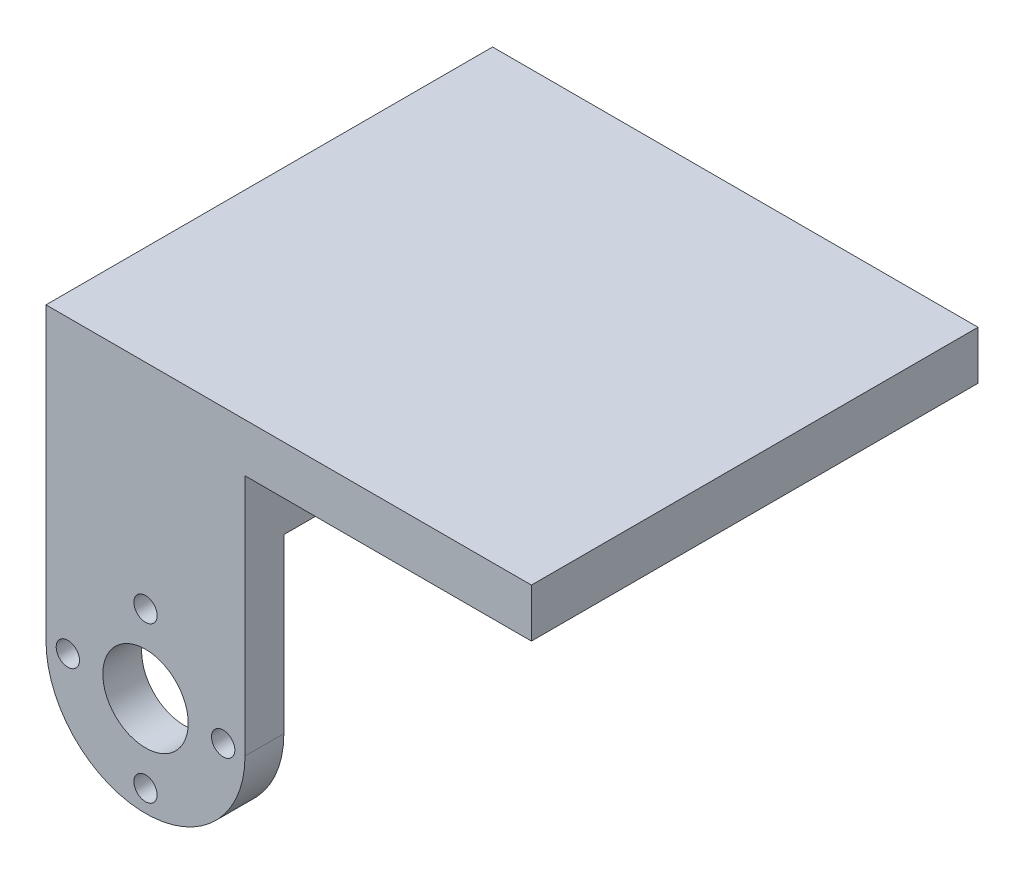
ISO-10303-21;
HEADER;
FILE_DESCRIPTION(('STEP AP214'),'2;1');
FILE_NAME('part.step','',(''),(''),'','','');
FILE_SCHEMA(('AUTOMOTIVE_DESIGN { 1 0 10303 214 1 1 1 1 }'));
ENDSEC;
DATA;
#1=APPLICATION_CONTEXT('core data for automotive mechanical design processes');
#2=APPLICATION_PROTOCOL_DEFINITION('international standard','automotive_design',2000,#1);
#3=PRODUCT_CONTEXT('',#1,'mechanical');
#4=PRODUCT('Part','Part','',(#3));
#5=PRODUCT_RELATED_PRODUCT_CATEGORY('part','',(#4));
#6=PRODUCT_DEFINITION_FORMATION('','',#4);
#7=PRODUCT_DEFINITION_CONTEXT('part definition',#1,'design');
#8=PRODUCT_DEFINITION('design','',#6,#7);
#9=PRODUCT_DEFINITION_SHAPE('','',#8);
#10=(LENGTH_UNIT() NAMED_UNIT(*) SI_UNIT(.MILLI.,.METRE.));
#11=(NAMED_UNIT(*) PLANE_ANGLE_UNIT() SI_UNIT($,.RADIAN.));
#12=(NAMED_UNIT(*) SI_UNIT($,.STERADIAN.) SOLID_ANGLE_UNIT());
#13=UNCERTAINTY_MEASURE_WITH_UNIT(LENGTH_MEASURE(1.E-05),#10,'distance_accuracy_value','');
#14=(GEOMETRIC_REPRESENTATION_CONTEXT(3) GLOBAL_UNCERTAINTY_ASSIGNED_CONTEXT((#13)) GLOBAL_UNIT_ASSIGNED_CONTEXT((#10,
#11,#12)) REPRESENTATION_CONTEXT('',''));
#15=CARTESIAN_POINT('',(0.,0.,0.));
#16=DIRECTION('',(0.,0.,1.));
#17=DIRECTION('',(1.,0.,0.));
#18=AXIS2_PLACEMENT_3D('',#15,#16,#17);
#19=CARTESIAN_POINT('',(0.,8.,-46.));
#20=DIRECTION('',(0.,0.,1.));
#21=DIRECTION('',(1.,0.,0.));
#22=AXIS2_PLACEMENT_3D('',#19,#20,#21);
#23=CYLINDRICAL_SURFACE('',#22,1.2);
#24=CARTESIAN_POINT('',(0.,8.,-4.));
#25=DIRECTION('',(0.,0.,1.));
#26=DIRECTION('',(0.,-1.,0.));
#27=AXIS2_PLACEMENT_3D('',#24,#25,#26);
#28=CIRCLE('',#27,1.2);
#29=CARTESIAN_POINT('',(0.,6.8,-4.));
#30=VERTEX_POINT('',#29);
#31=EDGE_CURVE('E184',#30,#30,#28,.F.);
#32=ORIENTED_EDGE('',*,*,#31,.T.);
#33=EDGE_LOOP('',(#32));
#34=FACE_BOUND('',#33,.T.);
#35=CARTESIAN_POINT('',(0.,8.,0.));
#36=DIRECTION('',(0.,0.,1.));
#37=DIRECTION('',(1.,0.,0.));
#38=AXIS2_PLACEMENT_3D('',#35,#36,#37);
#39=CIRCLE('',#38,1.2);
#40=CARTESIAN_POINT('',(1.2,8.,0.));
#41=VERTEX_POINT('',#40);
#42=EDGE_CURVE('E144',#41,#41,#39,.T.);
#43=ORIENTED_EDGE('',*,*,#42,.T.);
#44=EDGE_LOOP('',(#43));
#45=FACE_BOUND('',#44,.T.);
#46=ADVANCED_FACE('F71',(#34,#45),#23,.F.);
#47=CARTESIAN_POINT('',(0.,-8.,-46.));
#48=DIRECTION('',(0.,0.,1.));
#49=DIRECTION('',(1.,0.,0.));
#50=AXIS2_PLACEMENT_3D('',#47,#48,#49);
#51=CYLINDRICAL_SURFACE('',#50,1.2);
#52=CARTESIAN_POINT('',(0.,-8.,-4.));
#53=DIRECTION('',(0.,0.,1.));
#54=DIRECTION('',(0.,-1.,0.));
#55=AXIS2_PLACEMENT_3D('',#52,#53,#54);
#56=CIRCLE('',#55,1.2);
#57=CARTESIAN_POINT('',(0.,-9.2,-4.));
#58=VERTEX_POINT('',#57);
#59=EDGE_CURVE('E188',#58,#58,#56,.F.);
#60=ORIENTED_EDGE('',*,*,#59,.T.);
#61=EDGE_LOOP('',(#60));
#62=FACE_BOUND('',#61,.T.);
#63=CARTESIAN_POINT('',(0.,-8.,0.));
#64=DIRECTION('',(0.,0.,1.));
#65=DIRECTION('',(1.,0.,0.));
#66=AXIS2_PLACEMENT_3D('',#63,#64,#65);
#67=CIRCLE('',#66,1.2);
#68=CARTESIAN_POINT('',(1.19999999999994,-8.,0.));
#69=VERTEX_POINT('',#68);
#70=EDGE_CURVE('E241',#69,#69,#67,.T.);
#71=ORIENTED_EDGE('',*,*,#70,.T.);
#72=EDGE_LOOP('',(#71));
#73=FACE_BOUND('',#72,.T.);
#74=ADVANCED_FACE('F295',(#62,#73),#51,.F.);
#75=CARTESIAN_POINT('',(8.,0.,-46.));
#76=DIRECTION('',(0.,0.,1.));
#77=DIRECTION('',(1.,0.,0.));
#78=AXIS2_PLACEMENT_3D('',#75,#76,#77);
#79=CYLINDRICAL_SURFACE('',#78,1.2);
#80=CARTESIAN_POINT('',(8.,0.,-4.));
#81=DIRECTION('',(0.,0.,1.));
#82=DIRECTION('',(0.,-1.,0.));
#83=AXIS2_PLACEMENT_3D('',#80,#81,#82);
#84=CIRCLE('',#83,1.2);
#85=CARTESIAN_POINT('',(8.,-1.20000000000003,-4.));
#86=VERTEX_POINT('',#85);
#87=EDGE_CURVE('E194',#86,#86,#84,.F.);
#88=ORIENTED_EDGE('',*,*,#87,.T.);
#89=EDGE_LOOP('',(#88));
#90=FACE_BOUND('',#89,.T.);
#91=CARTESIAN_POINT('',(8.,0.,0.));
#92=DIRECTION('',(0.,0.,1.));
#93=DIRECTION('',(1.,0.,0.));
#94=AXIS2_PLACEMENT_3D('',#91,#92,#93);
#95=CIRCLE('',#94,1.2);
#96=CARTESIAN_POINT('',(9.2,0.,0.));
#97=VERTEX_POINT('',#96);
#98=EDGE_CURVE('E237',#97,#97,#95,.T.);
#99=ORIENTED_EDGE('',*,*,#98,.T.);
#100=EDGE_LOOP('',(#99));
#101=FACE_BOUND('',#100,.T.);
#102=ADVANCED_FACE('F301',(#90,#101),#79,.F.);
#103=CARTESIAN_POINT('',(0.,0.,-46.));
#104=DIRECTION('',(0.,0.,1.));
#105=DIRECTION('',(1.,0.,0.));
#106=AXIS2_PLACEMENT_3D('',#103,#104,#105);
#107=CYLINDRICAL_SURFACE('',#106,4.4);
#108=CARTESIAN_POINT('',(0.,0.,-4.));
#109=DIRECTION('',(0.,0.,1.));
#110=DIRECTION('',(0.,-1.,0.));
#111=AXIS2_PLACEMENT_3D('',#108,#109,#110);
#112=CIRCLE('',#111,4.4);
#113=CARTESIAN_POINT('',(0.,-4.4,-4.));
#114=VERTEX_POINT('',#113);
#115=EDGE_CURVE('E401',#114,#114,#112,.F.);
#116=ORIENTED_EDGE('',*,*,#115,.T.);
#117=EDGE_LOOP('',(#116));
#118=FACE_BOUND('',#117,.T.);
#119=CARTESIAN_POINT('',(0.,0.,0.));
#120=DIRECTION('',(0.,0.,1.));
#121=DIRECTION('',(1.,0.,0.));
#122=AXIS2_PLACEMENT_3D('',#119,#120,#121);
#123=CIRCLE('',#122,4.4);
#124=CARTESIAN_POINT('',(4.4,0.,0.));
#125=VERTEX_POINT('',#124);
#126=EDGE_CURVE('E233',#125,#125,#123,.T.);
#127=ORIENTED_EDGE('',*,*,#126,.T.);
#128=EDGE_LOOP('',(#127));
#129=FACE_BOUND('',#128,.T.);
#130=ADVANCED_FACE('F412',(#118,#129),#107,.F.);
#131=CARTESIAN_POINT('',(-8.,0.,-46.));
#132=DIRECTION('',(0.,0.,1.));
#133=DIRECTION('',(1.,0.,0.));
#134=AXIS2_PLACEMENT_3D('',#131,#132,#133);
#135=CYLINDRICAL_SURFACE('',#134,1.2);
#136=CARTESIAN_POINT('',(-8.,0.,-4.));
#137=DIRECTION('',(0.,0.,1.));
#138=DIRECTION('',(0.,-1.,0.));
#139=AXIS2_PLACEMENT_3D('',#136,#137,#138);
#140=CIRCLE('',#139,1.2);
#141=CARTESIAN_POINT('',(-8.,-1.19999999999992,-4.));
#142=VERTEX_POINT('',#141);
#143=EDGE_CURVE('E397',#142,#142,#140,.F.);
#144=ORIENTED_EDGE('',*,*,#143,.T.);
#145=EDGE_LOOP('',(#144));
#146=FACE_BOUND('',#145,.T.);
#147=CARTESIAN_POINT('',(-8.,0.,0.));
#148=DIRECTION('',(0.,0.,1.));
#149=DIRECTION('',(1.,0.,0.));
#150=AXIS2_PLACEMENT_3D('',#147,#148,#149);
#151=CIRCLE('',#150,1.2);
#152=CARTESIAN_POINT('',(-6.8,0.,0.));
#153=VERTEX_POINT('',#152);
#154=EDGE_CURVE('E154',#153,#153,#151,.T.);
#155=ORIENTED_EDGE('',*,*,#154,.T.);
#156=EDGE_LOOP('',(#155));
#157=FACE_BOUND('',#156,.T.);
#158=ADVANCED_FACE('F314',(#146,#157),#135,.F.);
#159=CARTESIAN_POINT('',(0.,0.,-46.));
#160=DIRECTION('',(0.,0.,1.));
#161=DIRECTION('',(1.,0.,0.));
#162=AXIS2_PLACEMENT_3D('',#159,#160,#161);
#163=CYLINDRICAL_SURFACE('',#162,10.25);
#164=CARTESIAN_POINT('',(0.,0.,-4.));
#165=DIRECTION('',(0.,0.,1.));
#166=DIRECTION('',(0.,-1.,0.));
#167=AXIS2_PLACEMENT_3D('',#164,#165,#166);
#168=CIRCLE('',#167,10.25);
#169=CARTESIAN_POINT('',(10.25,0.,-4.));
#170=VERTEX_POINT('',#169);
#171=CARTESIAN_POINT('',(-10.25,0.,-4.));
#172=VERTEX_POINT('',#171);
#173=EDGE_CURVE('E273',#170,#172,#168,.F.);
#174=ORIENTED_EDGE('',*,*,#173,.F.);
#175=DIRECTION('',(0.,0.,1.));
#176=VECTOR('',#175,1.);
#177=CARTESIAN_POINT('',(10.25,0.,-46.));
#178=LINE('',#177,#176);
#179=CARTESIAN_POINT('',(10.25,0.,0.));
#180=VERTEX_POINT('',#179);
#181=EDGE_CURVE('E258',#170,#180,#178,.T.);
#182=ORIENTED_EDGE('',*,*,#181,.T.);
#183=CARTESIAN_POINT('',(0.,0.,0.));
#184=DIRECTION('',(0.,0.,1.));
#185=DIRECTION('',(1.,0.,0.));
#186=AXIS2_PLACEMENT_3D('',#183,#184,#185);
#187=CIRCLE('',#186,10.25);
#188=CARTESIAN_POINT('',(-10.25,0.,0.));
#189=VERTEX_POINT('',#188);
#190=EDGE_CURVE('E143',#189,#180,#187,.T.);
#191=ORIENTED_EDGE('',*,*,#190,.F.);
#192=DIRECTION('',(0.,0.,1.));
#193=VECTOR('',#192,1.);
#194=CARTESIAN_POINT('',(-10.25,0.,-46.));
#195=LINE('',#194,#193);
#196=EDGE_CURVE('E137',#172,#189,#195,.T.);
#197=ORIENTED_EDGE('',*,*,#196,.F.);
#198=EDGE_LOOP('',(#174,#182,#191,#197));
#199=FACE_BOUND('',#198,.T.);
#200=ADVANCED_FACE('F271',(#199),#163,.T.);
#201=CARTESIAN_POINT('',(0.,8.,-42.));
#202=DIRECTION('',(0.,0.,-1.));
#203=DIRECTION('',(-1.,0.,0.));
#204=AXIS2_PLACEMENT_3D('',#201,#202,#203);
#205=CIRCLE('',#204,1.2);
#206=CARTESIAN_POINT('',(-1.2,8.,-42.));
#207=VERTEX_POINT('',#206);
#208=EDGE_CURVE('E320',#207,#207,#205,.F.);
#209=ORIENTED_EDGE('',*,*,#208,.T.);
#210=EDGE_LOOP('',(#209));
#211=FACE_BOUND('',#210,.T.);
#212=CARTESIAN_POINT('',(0.,8.,-46.));
#213=DIRECTION('',(0.,0.,1.));
#214=DIRECTION('',(1.,0.,0.));
#215=AXIS2_PLACEMENT_3D('',#212,#213,#214);
#216=CIRCLE('',#215,1.2);
#217=CARTESIAN_POINT('',(1.2,8.,-46.));
#218=VERTEX_POINT('',#217);
#219=EDGE_CURVE('E215',#218,#218,#216,.T.);
#220=ORIENTED_EDGE('',*,*,#219,.F.);
#221=EDGE_LOOP('',(#220));
#222=FACE_BOUND('',#221,.T.);
#223=ADVANCED_FACE('F297',(#211,#222),#23,.F.);
#224=CARTESIAN_POINT('',(0.,-8.,-42.));
#225=DIRECTION('',(0.,0.,-1.));
#226=DIRECTION('',(-1.,0.,0.));
#227=AXIS2_PLACEMENT_3D('',#224,#225,#226);
#228=CIRCLE('',#227,1.2);
#229=CARTESIAN_POINT('',(-1.20000000000006,-8.,-42.));
#230=VERTEX_POINT('',#229);
#231=EDGE_CURVE('E386',#230,#230,#228,.F.);
#232=ORIENTED_EDGE('',*,*,#231,.T.);
#233=EDGE_LOOP('',(#232));
#234=FACE_BOUND('',#233,.T.);
#235=CARTESIAN_POINT('',(0.,-8.,-46.));
#236=DIRECTION('',(0.,0.,1.));
#237=DIRECTION('',(1.,0.,0.));
#238=AXIS2_PLACEMENT_3D('',#235,#236,#237);
#239=CIRCLE('',#238,1.2);
#240=CARTESIAN_POINT('',(1.19999999999994,-8.,-46.));
#241=VERTEX_POINT('',#240);
#242=EDGE_CURVE('E211',#241,#241,#239,.T.);
#243=ORIENTED_EDGE('',*,*,#242,.F.);
#244=EDGE_LOOP('',(#243));
#245=FACE_BOUND('',#244,.T.);
#246=ADVANCED_FACE('F304',(#234,#245),#51,.F.);
#247=CARTESIAN_POINT('',(8.,0.,-42.));
#248=DIRECTION('',(0.,0.,-1.));
#249=DIRECTION('',(-1.,0.,0.));
#250=AXIS2_PLACEMENT_3D('',#247,#248,#249);
#251=CIRCLE('',#250,1.2);
#252=CARTESIAN_POINT('',(6.8,0.,-42.));
#253=VERTEX_POINT('',#252);
#254=EDGE_CURVE('E382',#253,#253,#251,.F.);
#255=ORIENTED_EDGE('',*,*,#254,.T.);
#256=EDGE_LOOP('',(#255));
#257=FACE_BOUND('',#256,.T.);
#258=CARTESIAN_POINT('',(8.,0.,-46.));
#259=DIRECTION('',(0.,0.,1.));
#260=DIRECTION('',(1.,0.,0.));
#261=AXIS2_PLACEMENT_3D('',#258,#259,#260);
#262=CIRCLE('',#261,1.2);
#263=CARTESIAN_POINT('',(9.2,0.,-46.));
#264=VERTEX_POINT('',#263);
#265=EDGE_CURVE('E207',#264,#264,#262,.T.);
#266=ORIENTED_EDGE('',*,*,#265,.F.);
#267=EDGE_LOOP('',(#266));
#268=FACE_BOUND('',#267,.T.);
#269=ADVANCED_FACE('F312',(#257,#268),#79,.F.);
#270=CARTESIAN_POINT('',(0.,0.,-42.));
#271=DIRECTION('',(0.,0.,-1.));
#272=DIRECTION('',(-1.,0.,0.));
#273=AXIS2_PLACEMENT_3D('',#270,#271,#272);
#274=CIRCLE('',#273,4.4);
#275=CARTESIAN_POINT('',(-4.4,0.,-42.));
#276=VERTEX_POINT('',#275);
#277=EDGE_CURVE('E378',#276,#276,#274,.F.);
#278=ORIENTED_EDGE('',*,*,#277,.T.);
#279=EDGE_LOOP('',(#278));
#280=FACE_BOUND('',#279,.T.);
#281=CARTESIAN_POINT('',(0.,0.,-46.));
#282=DIRECTION('',(0.,0.,1.));
#283=DIRECTION('',(1.,0.,0.));
#284=AXIS2_PLACEMENT_3D('',#281,#282,#283);
#285=CIRCLE('',#284,4.4);
#286=CARTESIAN_POINT('',(4.4,0.,-46.));
#287=VERTEX_POINT('',#286);
#288=EDGE_CURVE('E202',#287,#287,#285,.T.);
#289=ORIENTED_EDGE('',*,*,#288,.F.);
#290=EDGE_LOOP('',(#289));
#291=FACE_BOUND('',#290,.T.);
#292=ADVANCED_FACE('F442',(#280,#291),#107,.F.);
#293=CARTESIAN_POINT('',(-8.,0.,-42.));
#294=DIRECTION('',(0.,0.,-1.));
#295=DIRECTION('',(-1.,0.,0.));
#296=AXIS2_PLACEMENT_3D('',#293,#294,#295);
#297=CIRCLE('',#296,1.2);
#298=CARTESIAN_POINT('',(-9.2,0.,-42.));
#299=VERTEX_POINT('',#298);
#300=EDGE_CURVE('E374',#299,#299,#297,.F.);
#301=ORIENTED_EDGE('',*,*,#300,.T.);
#302=EDGE_LOOP('',(#301));
#303=FACE_BOUND('',#302,.T.);
#304=CARTESIAN_POINT('',(-8.,0.,-46.));
#305=DIRECTION('',(0.,0.,1.));
#306=DIRECTION('',(1.,0.,0.));
#307=AXIS2_PLACEMENT_3D('',#304,#305,#306);
#308=CIRCLE('',#307,1.2);
#309=CARTESIAN_POINT('',(-6.8,0.,-46.));
#310=VERTEX_POINT('',#309);
#311=EDGE_CURVE('E198',#310,#310,#308,.T.);
#312=ORIENTED_EDGE('',*,*,#311,.F.);
#313=EDGE_LOOP('',(#312));
#314=FACE_BOUND('',#313,.T.);
#315=ADVANCED_FACE('F325',(#303,#314),#135,.F.);
#316=CARTESIAN_POINT('',(0.,0.,-46.));
#317=DIRECTION('',(0.,0.,1.));
#318=DIRECTION('',(1.,0.,0.));
#319=AXIS2_PLACEMENT_3D('',#316,#317,#318);
#320=PLANE('',#319);
#321=ORIENTED_EDGE('',*,*,#311,.T.);
#322=EDGE_LOOP('',(#321));
#323=FACE_BOUND('',#322,.T.);
#324=ORIENTED_EDGE('',*,*,#288,.T.);
#325=EDGE_LOOP('',(#324));
#326=FACE_BOUND('',#325,.T.);
#327=ORIENTED_EDGE('',*,*,#265,.T.);
#328=EDGE_LOOP('',(#327));
#329=FACE_BOUND('',#328,.T.);
#330=ORIENTED_EDGE('',*,*,#242,.T.);
#331=EDGE_LOOP('',(#330));
#332=FACE_BOUND('',#331,.T.);
#333=ORIENTED_EDGE('',*,*,#219,.T.);
#334=EDGE_LOOP('',(#333));
#335=FACE_BOUND('',#334,.T.);
#336=DIRECTION('',(0.,1.,0.));
#337=VECTOR('',#336,1.);
#338=CARTESIAN_POINT('',(-10.25,0.,-46.));
#339=LINE('',#338,#337);
#340=CARTESIAN_POINT('',(-10.25,0.,-46.));
#341=VERTEX_POINT('',#340);
#342=CARTESIAN_POINT('',(-10.25,30.,-46.));
#343=VERTEX_POINT('',#342);
#344=EDGE_CURVE('E219',#341,#343,#339,.T.);
#345=ORIENTED_EDGE('',*,*,#344,.T.);
#346=DIRECTION('',(1.,0.,0.));
#347=VECTOR('',#346,1.);
#348=CARTESIAN_POINT('',(-10.25,30.,-46.));
#349=LINE('',#348,#347);
#350=CARTESIAN_POINT('',(39.75,30.,-46.));
#351=VERTEX_POINT('',#350);
#352=EDGE_CURVE('E152',#343,#351,#349,.T.);
#353=ORIENTED_EDGE('',*,*,#352,.T.);
#354=DIRECTION('',(0.,1.,0.));
#355=VECTOR('',#354,1.);
#356=CARTESIAN_POINT('',(39.75,25.,-46.));
#357=LINE('',#356,#355);
#358=CARTESIAN_POINT('',(39.75,25.,-46.));
#359=VERTEX_POINT('',#358);
#360=EDGE_CURVE('E165',#359,#351,#357,.T.);
#361=ORIENTED_EDGE('',*,*,#360,.F.);
#362=DIRECTION('',(1.,0.,0.));
#363=VECTOR('',#362,1.);
#364=CARTESIAN_POINT('',(-10.25,25.,-46.));
#365=LINE('',#364,#363);
#366=CARTESIAN_POINT('',(10.25,25.,-46.));
#367=VERTEX_POINT('',#366);
#368=EDGE_CURVE('E161',#367,#359,#365,.T.);
#369=ORIENTED_EDGE('',*,*,#368,.F.);
#370=DIRECTION('',(0.,1.,0.));
#371=VECTOR('',#370,1.);
#372=CARTESIAN_POINT('',(10.25,0.,-46.));
#373=LINE('',#372,#371);
#374=CARTESIAN_POINT('',(10.25,0.,-46.));
#375=VERTEX_POINT('',#374);
#376=EDGE_CURVE('E226',#375,#367,#373,.T.);
#377=ORIENTED_EDGE('',*,*,#376,.F.);
#378=CARTESIAN_POINT('',(0.,0.,-46.));
#379=DIRECTION('',(0.,0.,1.));
#380=DIRECTION('',(1.,0.,0.));
#381=AXIS2_PLACEMENT_3D('',#378,#379,#380);
#382=CIRCLE('',#381,10.25);
#383=EDGE_CURVE('E222',#341,#375,#382,.T.);
#384=ORIENTED_EDGE('',*,*,#383,.F.);
#385=EDGE_LOOP('',(#345,#353,#361,#369,#377,#384));
#386=FACE_BOUND('',#385,.T.);
#387=ADVANCED_FACE('F323',(#323,#326,#329,#332,#335,#386),#320,.F.);
#388=CARTESIAN_POINT('',(0.,0.,-42.));
#389=DIRECTION('',(0.,0.,-1.));
#390=DIRECTION('',(-1.,0.,0.));
#391=AXIS2_PLACEMENT_3D('',#388,#389,#390);
#392=CIRCLE('',#391,10.25);
#393=CARTESIAN_POINT('',(-10.25,0.,-42.));
#394=VERTEX_POINT('',#393);
#395=CARTESIAN_POINT('',(10.25,0.,-42.));
#396=VERTEX_POINT('',#395);
#397=EDGE_CURVE('E371',#394,#396,#392,.F.);
#398=ORIENTED_EDGE('',*,*,#397,.F.);
#399=EDGE_CURVE('E259',#341,#394,#195,.T.);
#400=ORIENTED_EDGE('',*,*,#399,.F.);
#401=ORIENTED_EDGE('',*,*,#383,.T.);
#402=EDGE_CURVE('E254',#375,#396,#178,.T.);
#403=ORIENTED_EDGE('',*,*,#402,.T.);
#404=EDGE_LOOP('',(#398,#400,#401,#403));
#405=FACE_BOUND('',#404,.T.);
#406=ADVANCED_FACE('F316',(#405),#163,.T.);
#407=CARTESIAN_POINT('',(0.,0.,0.));
#408=DIRECTION('',(0.,0.,1.));
#409=DIRECTION('',(1.,0.,0.));
#410=AXIS2_PLACEMENT_3D('',#407,#408,#409);
#411=PLANE('',#410);
#412=ORIENTED_EDGE('',*,*,#154,.F.);
#413=EDGE_LOOP('',(#412));
#414=FACE_BOUND('',#413,.T.);
#415=ORIENTED_EDGE('',*,*,#126,.F.);
#416=EDGE_LOOP('',(#415));
#417=FACE_BOUND('',#416,.T.);
#418=ORIENTED_EDGE('',*,*,#98,.F.);
#419=EDGE_LOOP('',(#418));
#420=FACE_BOUND('',#419,.T.);
#421=ORIENTED_EDGE('',*,*,#70,.F.);
#422=EDGE_LOOP('',(#421));
#423=FACE_BOUND('',#422,.T.);
#424=ORIENTED_EDGE('',*,*,#42,.F.);
#425=EDGE_LOOP('',(#424));
#426=FACE_BOUND('',#425,.T.);
#427=DIRECTION('',(0.,1.,0.));
#428=VECTOR('',#427,1.);
#429=CARTESIAN_POINT('',(-10.25,0.,0.));
#430=LINE('',#429,#428);
#431=CARTESIAN_POINT('',(-10.25,30.,0.));
#432=VERTEX_POINT('',#431);
#433=EDGE_CURVE('E129',#189,#432,#430,.T.);
#434=ORIENTED_EDGE('',*,*,#433,.F.);
#435=ORIENTED_EDGE('',*,*,#190,.T.);
#436=DIRECTION('',(0.,1.,0.));
#437=VECTOR('',#436,1.);
#438=CARTESIAN_POINT('',(10.25,0.,0.));
#439=LINE('',#438,#437);
#440=CARTESIAN_POINT('',(10.25,25.,0.));
#441=VERTEX_POINT('',#440);
#442=EDGE_CURVE('E203',#180,#441,#439,.T.);
#443=ORIENTED_EDGE('',*,*,#442,.T.);
#444=DIRECTION('',(1.,0.,0.));
#445=VECTOR('',#444,1.);
#446=CARTESIAN_POINT('',(-10.25,25.,0.));
#447=LINE('',#446,#445);
#448=CARTESIAN_POINT('',(39.75,25.,0.));
#449=VERTEX_POINT('',#448);
#450=EDGE_CURVE('E167',#441,#449,#447,.T.);
#451=ORIENTED_EDGE('',*,*,#450,.T.);
#452=DIRECTION('',(0.,1.,0.));
#453=VECTOR('',#452,1.);
#454=CARTESIAN_POINT('',(39.75,25.,0.));
#455=LINE('',#454,#453);
#456=CARTESIAN_POINT('',(39.75,30.,0.));
#457=VERTEX_POINT('',#456);
#458=EDGE_CURVE('E159',#449,#457,#455,.T.);
#459=ORIENTED_EDGE('',*,*,#458,.T.);
#460=DIRECTION('',(1.,0.,0.));
#461=VECTOR('',#460,1.);
#462=CARTESIAN_POINT('',(-10.25,30.,0.));
#463=LINE('',#462,#461);
#464=EDGE_CURVE('E150',#432,#457,#463,.T.);
#465=ORIENTED_EDGE('',*,*,#464,.F.);
#466=EDGE_LOOP('',(#434,#435,#443,#451,#459,#465));
#467=FACE_BOUND('',#466,.T.);
#468=ADVANCED_FACE('F157',(#414,#417,#420,#423,#426,#467),#411,.T.);
#469=CARTESIAN_POINT('',(10.25,0.,-46.));
#470=DIRECTION('',(1.,0.,0.));
#471=DIRECTION('',(0.,0.,-1.));
#472=AXIS2_PLACEMENT_3D('',#469,#470,#471);
#473=PLANE('',#472);
#474=DIRECTION('',(0.,-1.,0.));
#475=VECTOR('',#474,1.);
#476=CARTESIAN_POINT('',(10.25,0.,-4.));
#477=LINE('',#476,#475);
#478=CARTESIAN_POINT('',(10.25,17.75,-4.));
#479=VERTEX_POINT('',#478);
#480=EDGE_CURVE('E392',#479,#170,#477,.T.);
#481=ORIENTED_EDGE('',*,*,#480,.F.);
#482=DIRECTION('',(0.,0.,1.));
#483=VECTOR('',#482,1.);
#484=CARTESIAN_POINT('',(10.25,17.75,-46.));
#485=LINE('',#484,#483);
#486=CARTESIAN_POINT('',(10.25,17.75,-42.));
#487=VERTEX_POINT('',#486);
#488=EDGE_CURVE('E356',#487,#479,#485,.T.);
#489=ORIENTED_EDGE('',*,*,#488,.F.);
#490=DIRECTION('',(0.,1.,0.));
#491=VECTOR('',#490,1.);
#492=CARTESIAN_POINT('',(10.25,0.,-42.));
#493=LINE('',#492,#491);
#494=EDGE_CURVE('E353',#396,#487,#493,.T.);
#495=ORIENTED_EDGE('',*,*,#494,.F.);
#496=ORIENTED_EDGE('',*,*,#402,.F.);
#497=ORIENTED_EDGE('',*,*,#376,.T.);
#498=DIRECTION('',(0.,0.,1.));
#499=VECTOR('',#498,1.);
#500=CARTESIAN_POINT('',(10.25,25.,-46.));
#501=LINE('',#500,#499);
#502=EDGE_CURVE('E80',#367,#441,#501,.T.);
#503=ORIENTED_EDGE('',*,*,#502,.T.);
#504=ORIENTED_EDGE('',*,*,#442,.F.);
#505=ORIENTED_EDGE('',*,*,#181,.F.);
#506=EDGE_LOOP('',(#481,#489,#495,#496,#497,#503,#504,#505));
#507=FACE_BOUND('',#506,.T.);
#508=ADVANCED_FACE('F277',(#507),#473,.T.);
#509=CARTESIAN_POINT('',(-10.25,0.,-46.));
#510=DIRECTION('',(1.,0.,0.));
#511=DIRECTION('',(0.,0.,-1.));
#512=AXIS2_PLACEMENT_3D('',#509,#510,#511);
#513=PLANE('',#512);
#514=DIRECTION('',(0.,0.,-1.));
#515=VECTOR('',#514,1.);
#516=CARTESIAN_POINT('',(-10.25,17.75,-4.));
#517=LINE('',#516,#515);
#518=CARTESIAN_POINT('',(-10.25,17.75,-4.));
#519=VERTEX_POINT('',#518);
#520=CARTESIAN_POINT('',(-10.25,17.75,-42.));
#521=VERTEX_POINT('',#520);
#522=EDGE_CURVE('E358',#519,#521,#517,.T.);
#523=ORIENTED_EDGE('',*,*,#522,.F.);
#524=DIRECTION('',(0.,-1.,0.));
#525=VECTOR('',#524,1.);
#526=CARTESIAN_POINT('',(-10.25,0.,-4.));
#527=LINE('',#526,#525);
#528=EDGE_CURVE('E12',#519,#172,#527,.T.);
#529=ORIENTED_EDGE('',*,*,#528,.T.);
#530=ORIENTED_EDGE('',*,*,#196,.T.);
#531=ORIENTED_EDGE('',*,*,#433,.T.);
#532=DIRECTION('',(0.,0.,1.));
#533=VECTOR('',#532,1.);
#534=CARTESIAN_POINT('',(-10.25,30.,-46.));
#535=LINE('',#534,#533);
#536=EDGE_CURVE('E134',#343,#432,#535,.T.);
#537=ORIENTED_EDGE('',*,*,#536,.F.);
#538=ORIENTED_EDGE('',*,*,#344,.F.);
#539=ORIENTED_EDGE('',*,*,#399,.T.);
#540=DIRECTION('',(0.,-1.,0.));
#541=VECTOR('',#540,1.);
#542=CARTESIAN_POINT('',(-10.25,-10.25,-42.));
#543=LINE('',#542,#541);
#544=EDGE_CURVE('E351',#521,#394,#543,.T.);
#545=ORIENTED_EDGE('',*,*,#544,.F.);
#546=EDGE_LOOP('',(#523,#529,#530,#531,#537,#538,#539,#545));
#547=FACE_BOUND('',#546,.T.);
#548=ADVANCED_FACE('F132',(#547),#513,.F.);
#549=CARTESIAN_POINT('',(-10.25,30.,-46.));
#550=DIRECTION('',(0.,-1.,0.));
#551=DIRECTION('',(0.,0.,-1.));
#552=AXIS2_PLACEMENT_3D('',#549,#550,#551);
#553=PLANE('',#552);
#554=ORIENTED_EDGE('',*,*,#464,.T.);
#555=DIRECTION('',(0.,0.,1.));
#556=VECTOR('',#555,1.);
#557=CARTESIAN_POINT('',(39.75,30.,-46.));
#558=LINE('',#557,#556);
#559=EDGE_CURVE('E155',#351,#457,#558,.T.);
#560=ORIENTED_EDGE('',*,*,#559,.F.);
#561=ORIENTED_EDGE('',*,*,#352,.F.);
#562=ORIENTED_EDGE('',*,*,#536,.T.);
#563=EDGE_LOOP('',(#554,#560,#561,#562));
#564=FACE_BOUND('',#563,.T.);
#565=ADVANCED_FACE('F148',(#564),#553,.F.);
#566=CARTESIAN_POINT('',(39.75,25.,-46.));
#567=DIRECTION('',(1.,0.,0.));
#568=DIRECTION('',(0.,0.,-1.));
#569=AXIS2_PLACEMENT_3D('',#566,#567,#568);
#570=PLANE('',#569);
#571=ORIENTED_EDGE('',*,*,#458,.F.);
#572=DIRECTION('',(0.,0.,1.));
#573=VECTOR('',#572,1.);
#574=CARTESIAN_POINT('',(39.75,25.,-46.));
#575=LINE('',#574,#573);
#576=EDGE_CURVE('E172',#359,#449,#575,.T.);
#577=ORIENTED_EDGE('',*,*,#576,.F.);
#578=ORIENTED_EDGE('',*,*,#360,.T.);
#579=ORIENTED_EDGE('',*,*,#559,.T.);
#580=EDGE_LOOP('',(#571,#577,#578,#579));
#581=FACE_BOUND('',#580,.T.);
#582=ADVANCED_FACE('F281',(#581),#570,.T.);
#583=CARTESIAN_POINT('',(-10.25,25.,-46.));
#584=DIRECTION('',(0.,-1.,0.));
#585=DIRECTION('',(0.,0.,-1.));
#586=AXIS2_PLACEMENT_3D('',#583,#584,#585);
#587=PLANE('',#586);
#588=ORIENTED_EDGE('',*,*,#502,.F.);
#589=ORIENTED_EDGE('',*,*,#368,.T.);
#590=ORIENTED_EDGE('',*,*,#576,.T.);
#591=ORIENTED_EDGE('',*,*,#450,.F.);
#592=EDGE_LOOP('',(#588,#589,#590,#591));
#593=FACE_BOUND('',#592,.T.);
#594=ADVANCED_FACE('F73',(#593),#587,.T.);
#595=CARTESIAN_POINT('',(35.75,-10.25,-4.));
#596=DIRECTION('',(0.,0.,1.));
#597=DIRECTION('',(0.,-1.,0.));
#598=AXIS2_PLACEMENT_3D('',#595,#596,#597);
#599=PLANE('',#598);
#600=ORIENTED_EDGE('',*,*,#59,.F.);
#601=EDGE_LOOP('',(#600));
#602=FACE_BOUND('',#601,.T.);
#603=ORIENTED_EDGE('',*,*,#115,.F.);
#604=EDGE_LOOP('',(#603));
#605=FACE_BOUND('',#604,.T.);
#606=ORIENTED_EDGE('',*,*,#173,.T.);
#607=ORIENTED_EDGE('',*,*,#528,.F.);
#608=DIRECTION('',(-1.,0.,0.));
#609=VECTOR('',#608,1.);
#610=CARTESIAN_POINT('',(35.75,17.75,-4.));
#611=LINE('',#610,#609);
#612=EDGE_CURVE('E87',#479,#519,#611,.T.);
#613=ORIENTED_EDGE('',*,*,#612,.F.);
#614=ORIENTED_EDGE('',*,*,#480,.T.);
#615=EDGE_LOOP('',(#606,#607,#613,#614));
#616=FACE_BOUND('',#615,.T.);
#617=ORIENTED_EDGE('',*,*,#143,.F.);
#618=EDGE_LOOP('',(#617));
#619=FACE_BOUND('',#618,.T.);
#620=ORIENTED_EDGE('',*,*,#87,.F.);
#621=EDGE_LOOP('',(#620));
#622=FACE_BOUND('',#621,.T.);
#623=ORIENTED_EDGE('',*,*,#31,.F.);
#624=EDGE_LOOP('',(#623));
#625=FACE_BOUND('',#624,.T.);
#626=ADVANCED_FACE('F280',(#602,#605,#616,#619,#622,#625),#599,.F.);
#627=CARTESIAN_POINT('',(35.75,-10.25,-42.));
#628=DIRECTION('',(0.,0.,-1.));
#629=DIRECTION('',(-1.,0.,0.));
#630=AXIS2_PLACEMENT_3D('',#627,#628,#629);
#631=PLANE('',#630);
#632=ORIENTED_EDGE('',*,*,#231,.F.);
#633=EDGE_LOOP('',(#632));
#634=FACE_BOUND('',#633,.T.);
#635=ORIENTED_EDGE('',*,*,#277,.F.);
#636=EDGE_LOOP('',(#635));
#637=FACE_BOUND('',#636,.T.);
#638=ORIENTED_EDGE('',*,*,#397,.T.);
#639=ORIENTED_EDGE('',*,*,#494,.T.);
#640=DIRECTION('',(-1.,0.,0.));
#641=VECTOR('',#640,1.);
#642=CARTESIAN_POINT('',(35.75,17.75,-42.));
#643=LINE('',#642,#641);
#644=EDGE_CURVE('E349',#487,#521,#643,.T.);
#645=ORIENTED_EDGE('',*,*,#644,.T.);
#646=ORIENTED_EDGE('',*,*,#544,.T.);
#647=EDGE_LOOP('',(#638,#639,#645,#646));
#648=FACE_BOUND('',#647,.T.);
#649=ORIENTED_EDGE('',*,*,#300,.F.);
#650=EDGE_LOOP('',(#649));
#651=FACE_BOUND('',#650,.T.);
#652=ORIENTED_EDGE('',*,*,#254,.F.);
#653=EDGE_LOOP('',(#652));
#654=FACE_BOUND('',#653,.T.);
#655=ORIENTED_EDGE('',*,*,#208,.F.);
#656=EDGE_LOOP('',(#655));
#657=FACE_BOUND('',#656,.T.);
#658=ADVANCED_FACE('F287',(#634,#637,#648,#651,#654,#657),#631,.F.);
#659=CARTESIAN_POINT('',(35.75,17.75,-4.));
#660=DIRECTION('',(0.,1.,0.));
#661=DIRECTION('',(0.,0.,1.));
#662=AXIS2_PLACEMENT_3D('',#659,#660,#661);
#663=PLANE('',#662);
#664=ORIENTED_EDGE('',*,*,#488,.T.);
#665=ORIENTED_EDGE('',*,*,#612,.T.);
#666=ORIENTED_EDGE('',*,*,#522,.T.);
#667=ORIENTED_EDGE('',*,*,#644,.F.);
#668=EDGE_LOOP('',(#664,#665,#666,#667));
#669=FACE_BOUND('',#668,.T.);
#670=ADVANCED_FACE('F359',(#669),#663,.F.);
#671=CLOSED_SHELL('',(#46,#74,#102,#130,#158,#200,#223,#246,#269,#292,#315,#387,#406,#468,#508,
#548,#565,#582,#594,#626,#658,#670));
#672=MANIFOLD_SOLID_BREP('B2',#671);
#673=ADVANCED_BREP_SHAPE_REPRESENTATION('',(#18,#672),#14);
#674=SHAPE_DEFINITION_REPRESENTATION(#9,#673);
ENDSEC;
END-ISO-10303-21;
